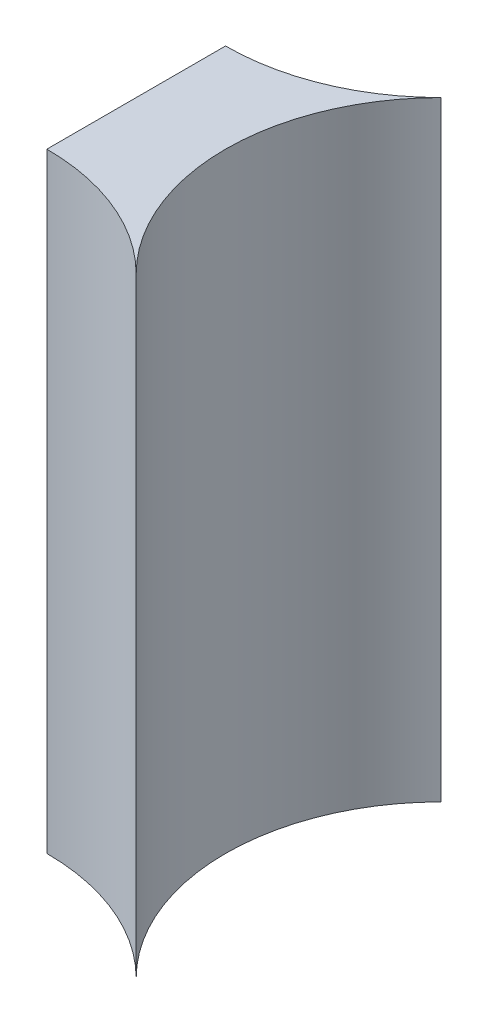
ISO-10303-21;
HEADER;
FILE_DESCRIPTION(('STEP AP214'),'2;1');
FILE_NAME('part.step','',(''),(''),'','','');
FILE_SCHEMA(('AUTOMOTIVE_DESIGN { 1 0 10303 214 1 1 1 1 }'));
ENDSEC;
DATA;
#1=APPLICATION_CONTEXT('core data for automotive mechanical design processes');
#2=APPLICATION_PROTOCOL_DEFINITION('international standard','automotive_design',2000,#1);
#3=PRODUCT_CONTEXT('',#1,'mechanical');
#4=PRODUCT('Part','Part','',(#3));
#5=PRODUCT_RELATED_PRODUCT_CATEGORY('part','',(#4));
#6=PRODUCT_DEFINITION_FORMATION('','',#4);
#7=PRODUCT_DEFINITION_CONTEXT('part definition',#1,'design');
#8=PRODUCT_DEFINITION('design','',#6,#7);
#9=PRODUCT_DEFINITION_SHAPE('','',#8);
#10=(LENGTH_UNIT() NAMED_UNIT(*) SI_UNIT(.MILLI.,.METRE.));
#11=(NAMED_UNIT(*) PLANE_ANGLE_UNIT() SI_UNIT($,.RADIAN.));
#12=(NAMED_UNIT(*) SI_UNIT($,.STERADIAN.) SOLID_ANGLE_UNIT());
#13=UNCERTAINTY_MEASURE_WITH_UNIT(LENGTH_MEASURE(1.E-05),#10,'distance_accuracy_value','');
#14=(GEOMETRIC_REPRESENTATION_CONTEXT(3) GLOBAL_UNCERTAINTY_ASSIGNED_CONTEXT((#13)) GLOBAL_UNIT_ASSIGNED_CONTEXT((#10,
#11,#12)) REPRESENTATION_CONTEXT('',''));
#15=CARTESIAN_POINT('',(0.,0.,0.));
#16=DIRECTION('',(0.,0.,1.));
#17=DIRECTION('',(1.,0.,0.));
#18=AXIS2_PLACEMENT_3D('',#15,#16,#17);
#19=CARTESIAN_POINT('',(0.,10.,-5.));
#20=DIRECTION('',(0.,-1.,0.));
#21=DIRECTION('',(0.,0.,-1.));
#22=AXIS2_PLACEMENT_3D('',#19,#20,#21);
#23=CYLINDRICAL_SURFACE('',#22,3.53553390593274);
#24=CARTESIAN_POINT('',(0.,0.,-5.));
#25=DIRECTION('',(0.,1.,0.));
#26=DIRECTION('',(0.,0.,1.));
#27=AXIS2_PLACEMENT_3D('',#24,#25,#26);
#28=CIRCLE('',#27,3.53553390593274);
#29=CARTESIAN_POINT('',(0.,0.,-1.46446609406727));
#30=VERTEX_POINT('',#29);
#31=CARTESIAN_POINT('',(2.5,0.,-2.50000000000001));
#32=VERTEX_POINT('',#31);
#33=EDGE_CURVE('E110',#30,#32,#28,.T.);
#34=ORIENTED_EDGE('',*,*,#33,.F.);
#35=DIRECTION('',(0.,-1.,0.));
#36=VECTOR('',#35,1.);
#37=CARTESIAN_POINT('',(0.,10.,-1.46446609406727));
#38=LINE('',#37,#36);
#39=CARTESIAN_POINT('',(0.,10.,-1.46446609406727));
#40=VERTEX_POINT('',#39);
#41=EDGE_CURVE('E11',#40,#30,#38,.T.);
#42=ORIENTED_EDGE('',*,*,#41,.F.);
#43=CARTESIAN_POINT('',(0.,10.,-5.));
#44=DIRECTION('',(0.,1.,0.));
#45=DIRECTION('',(0.,0.,1.));
#46=AXIS2_PLACEMENT_3D('',#43,#44,#45);
#47=CIRCLE('',#46,3.53553390593274);
#48=CARTESIAN_POINT('',(2.5,10.,-2.50000000000001));
#49=VERTEX_POINT('',#48);
#50=EDGE_CURVE('E103',#40,#49,#47,.T.);
#51=ORIENTED_EDGE('',*,*,#50,.T.);
#52=DIRECTION('',(0.,-1.,0.));
#53=VECTOR('',#52,1.);
#54=CARTESIAN_POINT('',(2.5,10.,-2.50000000000001));
#55=LINE('',#54,#53);
#56=EDGE_CURVE('E42',#49,#32,#55,.T.);
#57=ORIENTED_EDGE('',*,*,#56,.T.);
#58=EDGE_LOOP('',(#34,#42,#51,#57));
#59=FACE_BOUND('',#58,.T.);
#60=ADVANCED_FACE('F39',(#59),#23,.F.);
#61=CARTESIAN_POINT('',(0.,10.,-1.46446609406727));
#62=DIRECTION('',(1.,0.,0.));
#63=DIRECTION('',(0.,0.,-1.));
#64=AXIS2_PLACEMENT_3D('',#61,#62,#63);
#65=PLANE('',#64);
#66=DIRECTION('',(0.,0.,1.));
#67=VECTOR('',#66,1.);
#68=CARTESIAN_POINT('',(0.,0.,-1.46446609406727));
#69=LINE('',#68,#67);
#70=CARTESIAN_POINT('',(0.,0.,1.46446609406727));
#71=VERTEX_POINT('',#70);
#72=EDGE_CURVE('E73',#30,#71,#69,.T.);
#73=ORIENTED_EDGE('',*,*,#72,.T.);
#74=DIRECTION('',(0.,-1.,0.));
#75=VECTOR('',#74,1.);
#76=CARTESIAN_POINT('',(0.,10.,1.46446609406727));
#77=LINE('',#76,#75);
#78=CARTESIAN_POINT('',(0.,10.,1.46446609406727));
#79=VERTEX_POINT('',#78);
#80=EDGE_CURVE('E49',#79,#71,#77,.T.);
#81=ORIENTED_EDGE('',*,*,#80,.F.);
#82=DIRECTION('',(0.,0.,1.));
#83=VECTOR('',#82,1.);
#84=CARTESIAN_POINT('',(0.,10.,-1.46446609406727));
#85=LINE('',#84,#83);
#86=EDGE_CURVE('E90',#40,#79,#85,.T.);
#87=ORIENTED_EDGE('',*,*,#86,.F.);
#88=ORIENTED_EDGE('',*,*,#41,.T.);
#89=EDGE_LOOP('',(#73,#81,#87,#88));
#90=FACE_BOUND('',#89,.T.);
#91=ADVANCED_FACE('F126',(#90),#65,.F.);
#92=CARTESIAN_POINT('',(0.,10.,5.));
#93=DIRECTION('',(0.,-1.,0.));
#94=DIRECTION('',(0.,0.,-1.));
#95=AXIS2_PLACEMENT_3D('',#92,#93,#94);
#96=CYLINDRICAL_SURFACE('',#95,3.53553390593274);
#97=CARTESIAN_POINT('',(0.,0.,5.));
#98=DIRECTION('',(0.,-1.,0.));
#99=DIRECTION('',(0.,0.,-1.));
#100=AXIS2_PLACEMENT_3D('',#97,#98,#99);
#101=CIRCLE('',#100,3.53553390593274);
#102=CARTESIAN_POINT('',(2.49999999999999,0.,2.5));
#103=VERTEX_POINT('',#102);
#104=EDGE_CURVE('E98',#71,#103,#101,.T.);
#105=ORIENTED_EDGE('',*,*,#104,.T.);
#106=DIRECTION('',(0.,-1.,0.));
#107=VECTOR('',#106,1.);
#108=CARTESIAN_POINT('',(2.49999999999999,10.,2.5));
#109=LINE('',#108,#107);
#110=CARTESIAN_POINT('',(2.49999999999999,10.,2.5));
#111=VERTEX_POINT('',#110);
#112=EDGE_CURVE('E95',#111,#103,#109,.T.);
#113=ORIENTED_EDGE('',*,*,#112,.F.);
#114=CARTESIAN_POINT('',(0.,10.,5.));
#115=DIRECTION('',(0.,-1.,0.));
#116=DIRECTION('',(0.,0.,-1.));
#117=AXIS2_PLACEMENT_3D('',#114,#115,#116);
#118=CIRCLE('',#117,3.53553390593274);
#119=EDGE_CURVE('E85',#79,#111,#118,.T.);
#120=ORIENTED_EDGE('',*,*,#119,.F.);
#121=ORIENTED_EDGE('',*,*,#80,.T.);
#122=EDGE_LOOP('',(#105,#113,#120,#121));
#123=FACE_BOUND('',#122,.T.);
#124=ADVANCED_FACE('F96',(#123),#96,.F.);
#125=CARTESIAN_POINT('',(5.,10.,0.));
#126=DIRECTION('',(0.,-1.,0.));
#127=DIRECTION('',(0.,0.,-1.));
#128=AXIS2_PLACEMENT_3D('',#125,#126,#127);
#129=CYLINDRICAL_SURFACE('',#128,3.53553390593274);
#130=CARTESIAN_POINT('',(5.,0.,0.));
#131=DIRECTION('',(0.,1.,0.));
#132=DIRECTION('',(0.,0.,1.));
#133=AXIS2_PLACEMENT_3D('',#130,#131,#132);
#134=CIRCLE('',#133,3.53553390593274);
#135=EDGE_CURVE('E114',#32,#103,#134,.T.);
#136=ORIENTED_EDGE('',*,*,#135,.F.);
#137=ORIENTED_EDGE('',*,*,#56,.F.);
#138=CARTESIAN_POINT('',(5.,10.,0.));
#139=DIRECTION('',(0.,1.,0.));
#140=DIRECTION('',(0.,0.,1.));
#141=AXIS2_PLACEMENT_3D('',#138,#139,#140);
#142=CIRCLE('',#141,3.53553390593274);
#143=EDGE_CURVE('E89',#49,#111,#142,.T.);
#144=ORIENTED_EDGE('',*,*,#143,.T.);
#145=ORIENTED_EDGE('',*,*,#112,.T.);
#146=EDGE_LOOP('',(#136,#137,#144,#145));
#147=FACE_BOUND('',#146,.T.);
#148=ADVANCED_FACE('F101',(#147),#129,.F.);
#149=CARTESIAN_POINT('',(0.,10.,-5.));
#150=DIRECTION('',(0.,1.,0.));
#151=DIRECTION('',(0.,0.,1.));
#152=AXIS2_PLACEMENT_3D('',#149,#150,#151);
#153=PLANE('',#152);
#154=ORIENTED_EDGE('',*,*,#50,.F.);
#155=ORIENTED_EDGE('',*,*,#86,.T.);
#156=ORIENTED_EDGE('',*,*,#119,.T.);
#157=ORIENTED_EDGE('',*,*,#143,.F.);
#158=EDGE_LOOP('',(#154,#155,#156,#157));
#159=FACE_BOUND('',#158,.T.);
#160=ADVANCED_FACE('F88',(#159),#153,.T.);
#161=CARTESIAN_POINT('',(0.,0.,-5.));
#162=DIRECTION('',(0.,1.,0.));
#163=DIRECTION('',(0.,0.,1.));
#164=AXIS2_PLACEMENT_3D('',#161,#162,#163);
#165=PLANE('',#164);
#166=ORIENTED_EDGE('',*,*,#33,.T.);
#167=ORIENTED_EDGE('',*,*,#135,.T.);
#168=ORIENTED_EDGE('',*,*,#104,.F.);
#169=ORIENTED_EDGE('',*,*,#72,.F.);
#170=EDGE_LOOP('',(#166,#167,#168,#169));
#171=FACE_BOUND('',#170,.T.);
#172=ADVANCED_FACE('F123',(#171),#165,.F.);
#173=CLOSED_SHELL('',(#60,#91,#124,#148,#160,#172));
#174=MANIFOLD_SOLID_BREP('B2',#173);
#175=ADVANCED_BREP_SHAPE_REPRESENTATION('',(#18,#174),#14);
#176=SHAPE_DEFINITION_REPRESENTATION(#9,#175);
ENDSEC;
END-ISO-10303-21;
